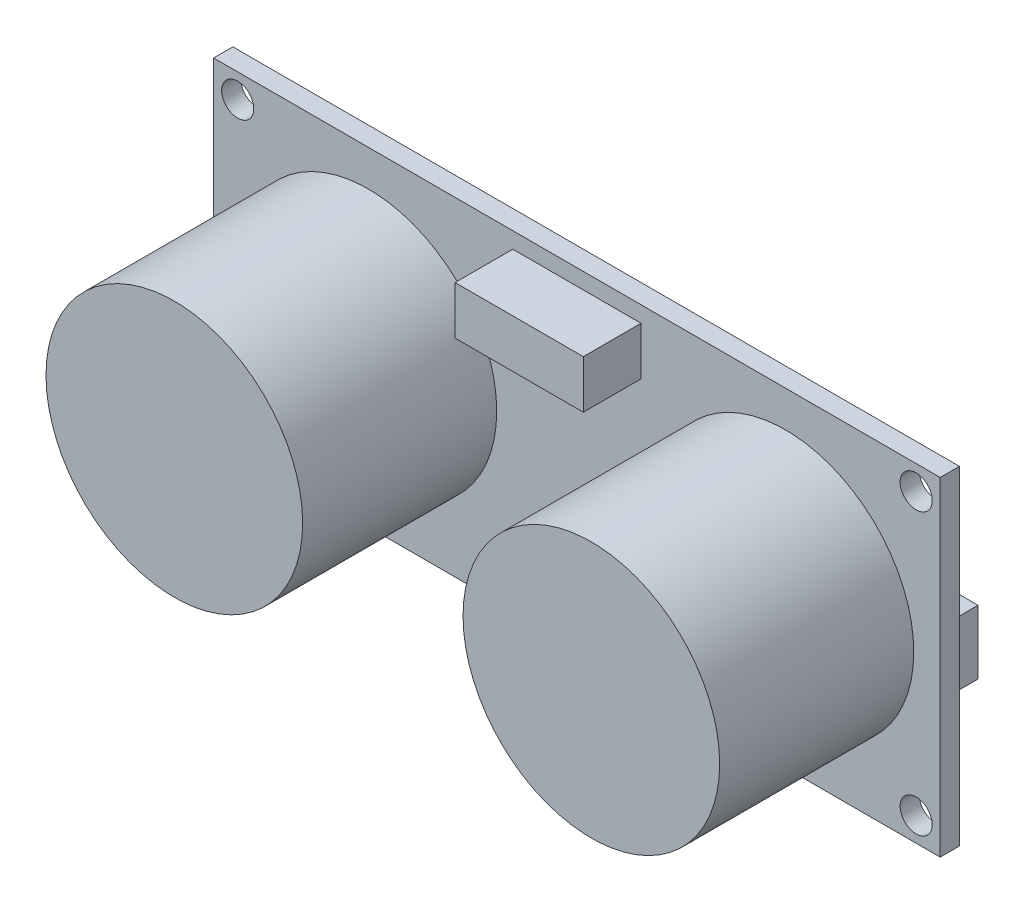
ISO-10303-21;
HEADER;
FILE_DESCRIPTION(('STEP AP214'),'2;1');
FILE_NAME('part.step','',(''),(''),'','','');
FILE_SCHEMA(('AUTOMOTIVE_DESIGN { 1 0 10303 214 1 1 1 1 }'));
ENDSEC;
DATA;
#1=APPLICATION_CONTEXT('core data for automotive mechanical design processes');
#2=APPLICATION_PROTOCOL_DEFINITION('international standard','automotive_design',2000,#1);
#3=PRODUCT_CONTEXT('',#1,'mechanical');
#4=PRODUCT('Part','Part','',(#3));
#5=PRODUCT_RELATED_PRODUCT_CATEGORY('part','',(#4));
#6=PRODUCT_DEFINITION_FORMATION('','',#4);
#7=PRODUCT_DEFINITION_CONTEXT('part definition',#1,'design');
#8=PRODUCT_DEFINITION('design','',#6,#7);
#9=PRODUCT_DEFINITION_SHAPE('','',#8);
#10=(LENGTH_UNIT() NAMED_UNIT(*) SI_UNIT(.MILLI.,.METRE.));
#11=(NAMED_UNIT(*) PLANE_ANGLE_UNIT() SI_UNIT($,.RADIAN.));
#12=(NAMED_UNIT(*) SI_UNIT($,.STERADIAN.) SOLID_ANGLE_UNIT());
#13=UNCERTAINTY_MEASURE_WITH_UNIT(LENGTH_MEASURE(1.E-05),#10,'distance_accuracy_value','');
#14=(GEOMETRIC_REPRESENTATION_CONTEXT(3) GLOBAL_UNCERTAINTY_ASSIGNED_CONTEXT((#13)) GLOBAL_UNIT_ASSIGNED_CONTEXT((#10,
#11,#12)) REPRESENTATION_CONTEXT('',''));
#15=CARTESIAN_POINT('',(0.,0.,0.));
#16=DIRECTION('',(0.,0.,1.));
#17=DIRECTION('',(1.,0.,0.));
#18=AXIS2_PLACEMENT_3D('',#15,#16,#17);
#19=CARTESIAN_POINT('',(0.,0.,1.2));
#20=DIRECTION('',(0.,0.,1.));
#21=DIRECTION('',(1.,0.,0.));
#22=AXIS2_PLACEMENT_3D('',#19,#20,#21);
#23=PLANE('',#22);
#24=CARTESIAN_POINT('',(4.03189160296243,-8.25,1.2));
#25=DIRECTION('',(0.,0.,1.));
#26=DIRECTION('',(1.,0.,0.));
#27=AXIS2_PLACEMENT_3D('',#24,#25,#26);
#28=CIRCLE('',#27,1.27);
#29=CARTESIAN_POINT('',(5.30189160296243,-8.25,1.2));
#30=VERTEX_POINT('',#29);
#31=EDGE_CURVE('E196',#30,#30,#28,.F.);
#32=ORIENTED_EDGE('',*,*,#31,.T.);
#33=EDGE_LOOP('',(#32));
#34=FACE_BOUND('',#33,.T.);
#35=CARTESIAN_POINT('',(-13.,0.,1.2));
#36=DIRECTION('',(0.,0.,1.));
#37=DIRECTION('',(1.,0.,0.));
#38=AXIS2_PLACEMENT_3D('',#35,#36,#37);
#39=CIRCLE('',#38,8.);
#40=CARTESIAN_POINT('',(-4.99999999999999,0.,1.2));
#41=VERTEX_POINT('',#40);
#42=EDGE_CURVE('E316',#41,#41,#39,.T.);
#43=ORIENTED_EDGE('',*,*,#42,.F.);
#44=EDGE_LOOP('',(#43));
#45=FACE_BOUND('',#44,.T.);
#46=CARTESIAN_POINT('',(13.,0.,1.2));
#47=DIRECTION('',(0.,0.,1.));
#48=DIRECTION('',(1.,0.,0.));
#49=AXIS2_PLACEMENT_3D('',#46,#47,#48);
#50=CIRCLE('',#49,8.);
#51=CARTESIAN_POINT('',(21.,0.,1.2));
#52=VERTEX_POINT('',#51);
#53=EDGE_CURVE('E311',#52,#52,#50,.T.);
#54=ORIENTED_EDGE('',*,*,#53,.F.);
#55=EDGE_LOOP('',(#54));
#56=FACE_BOUND('',#55,.T.);
#57=CARTESIAN_POINT('',(-21.15,-8.75000000000006,1.2));
#58=DIRECTION('',(0.,0.,1.));
#59=DIRECTION('',(-1.,0.,0.));
#60=AXIS2_PLACEMENT_3D('',#57,#58,#59);
#61=CIRCLE('',#60,1.);
#62=CARTESIAN_POINT('',(-22.15,-8.75000000000006,1.2));
#63=VERTEX_POINT('',#62);
#64=EDGE_CURVE('E296',#63,#63,#61,.T.);
#65=ORIENTED_EDGE('',*,*,#64,.F.);
#66=EDGE_LOOP('',(#65));
#67=FACE_BOUND('',#66,.T.);
#68=CARTESIAN_POINT('',(-21.15,8.75,1.2));
#69=DIRECTION('',(0.,0.,1.));
#70=DIRECTION('',(1.,0.,0.));
#71=AXIS2_PLACEMENT_3D('',#68,#69,#70);
#72=CIRCLE('',#71,1.);
#73=CARTESIAN_POINT('',(-20.15,8.75,1.2));
#74=VERTEX_POINT('',#73);
#75=EDGE_CURVE('E308',#74,#74,#72,.T.);
#76=ORIENTED_EDGE('',*,*,#75,.F.);
#77=EDGE_LOOP('',(#76));
#78=FACE_BOUND('',#77,.T.);
#79=DIRECTION('',(0.,1.,0.));
#80=VECTOR('',#79,1.);
#81=CARTESIAN_POINT('',(22.65,10.25,1.2));
#82=LINE('',#81,#80);
#83=CARTESIAN_POINT('',(22.65,-10.25,1.2));
#84=VERTEX_POINT('',#83);
#85=CARTESIAN_POINT('',(22.65,10.25,1.2));
#86=VERTEX_POINT('',#85);
#87=EDGE_CURVE('E320',#84,#86,#82,.T.);
#88=ORIENTED_EDGE('',*,*,#87,.T.);
#89=DIRECTION('',(-1.,0.,0.));
#90=VECTOR('',#89,1.);
#91=CARTESIAN_POINT('',(-22.65,10.25,1.2));
#92=LINE('',#91,#90);
#93=CARTESIAN_POINT('',(-22.65,10.25,1.2));
#94=VERTEX_POINT('',#93);
#95=EDGE_CURVE('E323',#86,#94,#92,.T.);
#96=ORIENTED_EDGE('',*,*,#95,.T.);
#97=DIRECTION('',(0.,-1.,0.));
#98=VECTOR('',#97,1.);
#99=CARTESIAN_POINT('',(-22.65,10.25,1.2));
#100=LINE('',#99,#98);
#101=CARTESIAN_POINT('',(-22.65,-10.25,1.2));
#102=VERTEX_POINT('',#101);
#103=EDGE_CURVE('E326',#94,#102,#100,.T.);
#104=ORIENTED_EDGE('',*,*,#103,.T.);
#105=DIRECTION('',(1.,0.,0.));
#106=VECTOR('',#105,1.);
#107=CARTESIAN_POINT('',(-22.65,-10.25,1.2));
#108=LINE('',#107,#106);
#109=EDGE_CURVE('E328',#102,#84,#108,.T.);
#110=ORIENTED_EDGE('',*,*,#109,.T.);
#111=EDGE_LOOP('',(#88,#96,#104,#110));
#112=FACE_BOUND('',#111,.T.);
#113=CARTESIAN_POINT('',(21.15,8.75,1.2));
#114=DIRECTION('',(0.,0.,1.));
#115=DIRECTION('',(-1.,0.,0.));
#116=AXIS2_PLACEMENT_3D('',#113,#114,#115);
#117=CIRCLE('',#116,1.);
#118=CARTESIAN_POINT('',(20.15,8.75,1.2));
#119=VERTEX_POINT('',#118);
#120=EDGE_CURVE('E302',#119,#119,#117,.T.);
#121=ORIENTED_EDGE('',*,*,#120,.F.);
#122=EDGE_LOOP('',(#121));
#123=FACE_BOUND('',#122,.T.);
#124=CARTESIAN_POINT('',(21.15,-8.74999999999996,1.2));
#125=DIRECTION('',(0.,0.,1.));
#126=DIRECTION('',(1.,0.,0.));
#127=AXIS2_PLACEMENT_3D('',#124,#125,#126);
#128=CIRCLE('',#127,1.);
#129=CARTESIAN_POINT('',(22.15,-8.74999999999996,1.2));
#130=VERTEX_POINT('',#129);
#131=EDGE_CURVE('E290',#130,#130,#128,.T.);
#132=ORIENTED_EDGE('',*,*,#131,.F.);
#133=EDGE_LOOP('',(#132));
#134=FACE_BOUND('',#133,.T.);
#135=DIRECTION('',(0.,1.,0.));
#136=VECTOR('',#135,1.);
#137=CARTESIAN_POINT('',(-4.,0.,1.2));
#138=LINE('',#137,#136);
#139=CARTESIAN_POINT('',(-4.,6.25,1.2));
#140=VERTEX_POINT('',#139);
#141=CARTESIAN_POINT('',(-4.,9.25,1.2));
#142=VERTEX_POINT('',#141);
#143=EDGE_CURVE('E277',#140,#142,#138,.T.);
#144=ORIENTED_EDGE('',*,*,#143,.T.);
#145=DIRECTION('',(1.,0.,0.));
#146=VECTOR('',#145,1.);
#147=CARTESIAN_POINT('',(0.,9.25,1.2));
#148=LINE('',#147,#146);
#149=CARTESIAN_POINT('',(4.,9.25,1.2));
#150=VERTEX_POINT('',#149);
#151=EDGE_CURVE('E280',#142,#150,#148,.T.);
#152=ORIENTED_EDGE('',*,*,#151,.T.);
#153=DIRECTION('',(0.,-1.,0.));
#154=VECTOR('',#153,1.);
#155=CARTESIAN_POINT('',(4.,0.,1.2));
#156=LINE('',#155,#154);
#157=CARTESIAN_POINT('',(4.,6.25,1.2));
#158=VERTEX_POINT('',#157);
#159=EDGE_CURVE('E271',#150,#158,#156,.T.);
#160=ORIENTED_EDGE('',*,*,#159,.T.);
#161=DIRECTION('',(-1.,0.,0.));
#162=VECTOR('',#161,1.);
#163=CARTESIAN_POINT('',(0.,6.25,1.2));
#164=LINE('',#163,#162);
#165=EDGE_CURVE('E274',#158,#140,#164,.T.);
#166=ORIENTED_EDGE('',*,*,#165,.T.);
#167=EDGE_LOOP('',(#144,#152,#160,#166));
#168=FACE_BOUND('',#167,.T.);
#169=ADVANCED_FACE('F35',(#34,#45,#56,#67,#78,#112,#123,#134,#168),#23,.T.);
#170=CARTESIAN_POINT('',(0.,0.,0.));
#171=DIRECTION('',(0.,0.,1.));
#172=DIRECTION('',(1.,0.,0.));
#173=AXIS2_PLACEMENT_3D('',#170,#171,#172);
#174=PLANE('',#173);
#175=CARTESIAN_POINT('',(4.03189160296243,-8.25,0.));
#176=DIRECTION('',(0.,0.,-1.));
#177=DIRECTION('',(-1.,0.,0.));
#178=AXIS2_PLACEMENT_3D('',#175,#176,#177);
#179=CIRCLE('',#178,1.27);
#180=CARTESIAN_POINT('',(2.76189160296243,-8.25,0.));
#181=VERTEX_POINT('',#180);
#182=EDGE_CURVE('E193',#181,#181,#179,.T.);
#183=ORIENTED_EDGE('',*,*,#182,.F.);
#184=EDGE_LOOP('',(#183));
#185=FACE_BOUND('',#184,.T.);
#186=DIRECTION('',(-1.,0.,0.));
#187=VECTOR('',#186,1.);
#188=CARTESIAN_POINT('',(0.,5.91088257171505,0.));
#189=LINE('',#188,#187);
#190=CARTESIAN_POINT('',(-16.2936688119185,5.91088257171505,0.));
#191=VERTEX_POINT('',#190);
#192=CARTESIAN_POINT('',(-21.6068216853702,5.91088257171505,0.));
#193=VERTEX_POINT('',#192);
#194=EDGE_CURVE('E43',#191,#193,#189,.T.);
#195=ORIENTED_EDGE('',*,*,#194,.T.);
#196=DIRECTION('',(0.,-1.,0.));
#197=VECTOR('',#196,1.);
#198=CARTESIAN_POINT('',(-21.6068216853702,0.,0.));
#199=LINE('',#198,#197);
#200=CARTESIAN_POINT('',(-21.6068216853702,-5.29101473647895,0.));
#201=VERTEX_POINT('',#200);
#202=EDGE_CURVE('E11',#193,#201,#199,.T.);
#203=ORIENTED_EDGE('',*,*,#202,.T.);
#204=DIRECTION('',(1.,0.,0.));
#205=VECTOR('',#204,1.);
#206=CARTESIAN_POINT('',(0.,-5.29101473647895,0.));
#207=LINE('',#206,#205);
#208=CARTESIAN_POINT('',(-16.2936688119185,-5.29101473647895,0.));
#209=VERTEX_POINT('',#208);
#210=EDGE_CURVE('E175',#201,#209,#207,.T.);
#211=ORIENTED_EDGE('',*,*,#210,.T.);
#212=DIRECTION('',(0.,1.,0.));
#213=VECTOR('',#212,1.);
#214=CARTESIAN_POINT('',(-16.2936688119185,0.,0.));
#215=LINE('',#214,#213);
#216=EDGE_CURVE('E374',#209,#191,#215,.T.);
#217=ORIENTED_EDGE('',*,*,#216,.T.);
#218=EDGE_LOOP('',(#195,#203,#211,#217));
#219=FACE_BOUND('',#218,.T.);
#220=DIRECTION('',(0.,-1.,0.));
#221=VECTOR('',#220,1.);
#222=CARTESIAN_POINT('',(-4.38335112059764,0.,0.));
#223=LINE('',#222,#221);
#224=CARTESIAN_POINT('',(-4.38335112059764,4.13983161389782,0.));
#225=VERTEX_POINT('',#224);
#226=CARTESIAN_POINT('',(-4.38335112059764,-2.45733320397138,0.));
#227=VERTEX_POINT('',#226);
#228=EDGE_CURVE('E367',#225,#227,#223,.T.);
#229=ORIENTED_EDGE('',*,*,#228,.T.);
#230=DIRECTION('',(1.,0.,0.));
#231=VECTOR('',#230,1.);
#232=CARTESIAN_POINT('',(0.,-2.45733320397138,0.));
#233=LINE('',#232,#231);
#234=CARTESIAN_POINT('',(5.18032405161542,-2.45733320397138,0.));
#235=VERTEX_POINT('',#234);
#236=EDGE_CURVE('E370',#227,#235,#233,.T.);
#237=ORIENTED_EDGE('',*,*,#236,.T.);
#238=DIRECTION('',(0.,1.,0.));
#239=VECTOR('',#238,1.);
#240=CARTESIAN_POINT('',(5.18032405161542,0.,0.));
#241=LINE('',#240,#239);
#242=CARTESIAN_POINT('',(5.18032405161542,4.13983161389782,0.));
#243=VERTEX_POINT('',#242);
#244=EDGE_CURVE('E361',#235,#243,#241,.T.);
#245=ORIENTED_EDGE('',*,*,#244,.T.);
#246=DIRECTION('',(-1.,0.,0.));
#247=VECTOR('',#246,1.);
#248=CARTESIAN_POINT('',(0.,4.13983161389782,0.));
#249=LINE('',#248,#247);
#250=EDGE_CURVE('E364',#243,#225,#249,.T.);
#251=ORIENTED_EDGE('',*,*,#250,.T.);
#252=EDGE_LOOP('',(#229,#237,#245,#251));
#253=FACE_BOUND('',#252,.T.);
#254=DIRECTION('',(0.,-1.,0.));
#255=VECTOR('',#254,1.);
#256=CARTESIAN_POINT('',(14.2569602104287,0.,0.));
#257=LINE('',#256,#255);
#258=CARTESIAN_POINT('',(14.2569602104287,1.5275314511174,0.));
#259=VERTEX_POINT('',#258);
#260=CARTESIAN_POINT('',(14.2569602104287,-2.45733320397138,0.));
#261=VERTEX_POINT('',#260);
#262=EDGE_CURVE('E355',#259,#261,#257,.T.);
#263=ORIENTED_EDGE('',*,*,#262,.T.);
#264=DIRECTION('',(1.,0.,0.));
#265=VECTOR('',#264,1.);
#266=CARTESIAN_POINT('',(0.,-2.45733320397138,0.));
#267=LINE('',#266,#265);
#268=CARTESIAN_POINT('',(22.0053081508791,-2.45733320397138,0.));
#269=VERTEX_POINT('',#268);
#270=EDGE_CURVE('E358',#261,#269,#267,.T.);
#271=ORIENTED_EDGE('',*,*,#270,.T.);
#272=DIRECTION('',(0.,1.,0.));
#273=VECTOR('',#272,1.);
#274=CARTESIAN_POINT('',(22.0053081508791,0.,0.));
#275=LINE('',#274,#273);
#276=CARTESIAN_POINT('',(22.0053081508791,1.5275314511174,0.));
#277=VERTEX_POINT('',#276);
#278=EDGE_CURVE('E349',#269,#277,#275,.T.);
#279=ORIENTED_EDGE('',*,*,#278,.T.);
#280=DIRECTION('',(-1.,0.,0.));
#281=VECTOR('',#280,1.);
#282=CARTESIAN_POINT('',(0.,1.5275314511174,0.));
#283=LINE('',#282,#281);
#284=EDGE_CURVE('E352',#277,#259,#283,.T.);
#285=ORIENTED_EDGE('',*,*,#284,.T.);
#286=EDGE_LOOP('',(#263,#271,#279,#285));
#287=FACE_BOUND('',#286,.T.);
#288=CARTESIAN_POINT('',(21.15,-8.74999999999996,0.));
#289=DIRECTION('',(0.,0.,1.));
#290=DIRECTION('',(1.,0.,0.));
#291=AXIS2_PLACEMENT_3D('',#288,#289,#290);
#292=CIRCLE('',#291,1.);
#293=CARTESIAN_POINT('',(22.15,-8.74999999999996,0.));
#294=VERTEX_POINT('',#293);
#295=EDGE_CURVE('E289',#294,#294,#292,.T.);
#296=ORIENTED_EDGE('',*,*,#295,.T.);
#297=EDGE_LOOP('',(#296));
#298=FACE_BOUND('',#297,.T.);
#299=CARTESIAN_POINT('',(-21.15,-8.75000000000006,0.));
#300=DIRECTION('',(0.,0.,1.));
#301=DIRECTION('',(-1.,0.,0.));
#302=AXIS2_PLACEMENT_3D('',#299,#300,#301);
#303=CIRCLE('',#302,1.);
#304=CARTESIAN_POINT('',(-22.15,-8.75000000000006,0.));
#305=VERTEX_POINT('',#304);
#306=EDGE_CURVE('E293',#305,#305,#303,.T.);
#307=ORIENTED_EDGE('',*,*,#306,.T.);
#308=EDGE_LOOP('',(#307));
#309=FACE_BOUND('',#308,.T.);
#310=CARTESIAN_POINT('',(21.15,8.75,0.));
#311=DIRECTION('',(0.,0.,1.));
#312=DIRECTION('',(-1.,0.,0.));
#313=AXIS2_PLACEMENT_3D('',#310,#311,#312);
#314=CIRCLE('',#313,1.);
#315=CARTESIAN_POINT('',(20.15,8.75,0.));
#316=VERTEX_POINT('',#315);
#317=EDGE_CURVE('E299',#316,#316,#314,.T.);
#318=ORIENTED_EDGE('',*,*,#317,.T.);
#319=EDGE_LOOP('',(#318));
#320=FACE_BOUND('',#319,.T.);
#321=CARTESIAN_POINT('',(-21.15,8.75,0.));
#322=DIRECTION('',(0.,0.,1.));
#323=DIRECTION('',(1.,0.,0.));
#324=AXIS2_PLACEMENT_3D('',#321,#322,#323);
#325=CIRCLE('',#324,1.);
#326=CARTESIAN_POINT('',(-20.15,8.75,0.));
#327=VERTEX_POINT('',#326);
#328=EDGE_CURVE('E305',#327,#327,#325,.T.);
#329=ORIENTED_EDGE('',*,*,#328,.T.);
#330=EDGE_LOOP('',(#329));
#331=FACE_BOUND('',#330,.T.);
#332=DIRECTION('',(0.,1.,0.));
#333=VECTOR('',#332,1.);
#334=CARTESIAN_POINT('',(22.65,10.25,0.));
#335=LINE('',#334,#333);
#336=CARTESIAN_POINT('',(22.65,-10.25,0.));
#337=VERTEX_POINT('',#336);
#338=CARTESIAN_POINT('',(22.65,10.25,0.));
#339=VERTEX_POINT('',#338);
#340=EDGE_CURVE('E319',#337,#339,#335,.T.);
#341=ORIENTED_EDGE('',*,*,#340,.F.);
#342=DIRECTION('',(1.,0.,0.));
#343=VECTOR('',#342,1.);
#344=CARTESIAN_POINT('',(-22.65,-10.25,0.));
#345=LINE('',#344,#343);
#346=CARTESIAN_POINT('',(-22.65,-10.25,0.));
#347=VERTEX_POINT('',#346);
#348=EDGE_CURVE('E324',#347,#337,#345,.T.);
#349=ORIENTED_EDGE('',*,*,#348,.F.);
#350=DIRECTION('',(0.,-1.,0.));
#351=VECTOR('',#350,1.);
#352=CARTESIAN_POINT('',(-22.65,10.25,0.));
#353=LINE('',#352,#351);
#354=CARTESIAN_POINT('',(-22.65,10.25,0.));
#355=VERTEX_POINT('',#354);
#356=EDGE_CURVE('E335',#355,#347,#353,.T.);
#357=ORIENTED_EDGE('',*,*,#356,.F.);
#358=DIRECTION('',(-1.,0.,0.));
#359=VECTOR('',#358,1.);
#360=CARTESIAN_POINT('',(-22.65,10.25,0.));
#361=LINE('',#360,#359);
#362=EDGE_CURVE('E333',#339,#355,#361,.T.);
#363=ORIENTED_EDGE('',*,*,#362,.F.);
#364=EDGE_LOOP('',(#341,#349,#357,#363));
#365=FACE_BOUND('',#364,.T.);
#366=ADVANCED_FACE('F378',(#185,#219,#253,#287,#298,#309,#320,#331,#365),#174,.F.);
#367=CARTESIAN_POINT('',(22.65,10.25,1.2));
#368=DIRECTION('',(-1.,0.,0.));
#369=DIRECTION('',(0.,0.,1.));
#370=AXIS2_PLACEMENT_3D('',#367,#368,#369);
#371=PLANE('',#370);
#372=ORIENTED_EDGE('',*,*,#340,.T.);
#373=DIRECTION('',(0.,0.,-1.));
#374=VECTOR('',#373,1.);
#375=CARTESIAN_POINT('',(22.65,10.25,1.2));
#376=LINE('',#375,#374);
#377=EDGE_CURVE('E346',#86,#339,#376,.T.);
#378=ORIENTED_EDGE('',*,*,#377,.F.);
#379=ORIENTED_EDGE('',*,*,#87,.F.);
#380=DIRECTION('',(0.,0.,-1.));
#381=VECTOR('',#380,1.);
#382=CARTESIAN_POINT('',(22.65,-10.25,1.2));
#383=LINE('',#382,#381);
#384=EDGE_CURVE('E330',#84,#337,#383,.T.);
#385=ORIENTED_EDGE('',*,*,#384,.T.);
#386=EDGE_LOOP('',(#372,#378,#379,#385));
#387=FACE_BOUND('',#386,.T.);
#388=ADVANCED_FACE('F37',(#387),#371,.F.);
#389=CARTESIAN_POINT('',(-22.65,10.25,1.2));
#390=DIRECTION('',(0.,-1.,0.));
#391=DIRECTION('',(0.,0.,-1.));
#392=AXIS2_PLACEMENT_3D('',#389,#390,#391);
#393=PLANE('',#392);
#394=ORIENTED_EDGE('',*,*,#362,.T.);
#395=DIRECTION('',(0.,0.,-1.));
#396=VECTOR('',#395,1.);
#397=CARTESIAN_POINT('',(-22.65,10.25,1.2));
#398=LINE('',#397,#396);
#399=EDGE_CURVE('E343',#94,#355,#398,.T.);
#400=ORIENTED_EDGE('',*,*,#399,.F.);
#401=ORIENTED_EDGE('',*,*,#95,.F.);
#402=ORIENTED_EDGE('',*,*,#377,.T.);
#403=EDGE_LOOP('',(#394,#400,#401,#402));
#404=FACE_BOUND('',#403,.T.);
#405=ADVANCED_FACE('F413',(#404),#393,.F.);
#406=CARTESIAN_POINT('',(-22.65,10.25,1.2));
#407=DIRECTION('',(1.,0.,0.));
#408=DIRECTION('',(0.,0.,-1.));
#409=AXIS2_PLACEMENT_3D('',#406,#407,#408);
#410=PLANE('',#409);
#411=ORIENTED_EDGE('',*,*,#356,.T.);
#412=DIRECTION('',(0.,0.,-1.));
#413=VECTOR('',#412,1.);
#414=CARTESIAN_POINT('',(-22.65,-10.25,1.2));
#415=LINE('',#414,#413);
#416=EDGE_CURVE('E340',#102,#347,#415,.T.);
#417=ORIENTED_EDGE('',*,*,#416,.F.);
#418=ORIENTED_EDGE('',*,*,#103,.F.);
#419=ORIENTED_EDGE('',*,*,#399,.T.);
#420=EDGE_LOOP('',(#411,#417,#418,#419));
#421=FACE_BOUND('',#420,.T.);
#422=ADVANCED_FACE('F410',(#421),#410,.F.);
#423=CARTESIAN_POINT('',(-22.65,-10.25,1.2));
#424=DIRECTION('',(0.,1.,0.));
#425=DIRECTION('',(0.,0.,1.));
#426=AXIS2_PLACEMENT_3D('',#423,#424,#425);
#427=PLANE('',#426);
#428=ORIENTED_EDGE('',*,*,#348,.T.);
#429=ORIENTED_EDGE('',*,*,#384,.F.);
#430=ORIENTED_EDGE('',*,*,#109,.F.);
#431=ORIENTED_EDGE('',*,*,#416,.T.);
#432=EDGE_LOOP('',(#428,#429,#430,#431));
#433=FACE_BOUND('',#432,.T.);
#434=ADVANCED_FACE('F407',(#433),#427,.F.);
#435=CARTESIAN_POINT('',(-21.15,8.75,1.2));
#436=DIRECTION('',(0.,0.,-1.));
#437=DIRECTION('',(-1.,0.,0.));
#438=AXIS2_PLACEMENT_3D('',#435,#436,#437);
#439=CYLINDRICAL_SURFACE('',#438,1.);
#440=ORIENTED_EDGE('',*,*,#75,.T.);
#441=EDGE_LOOP('',(#440));
#442=FACE_BOUND('',#441,.T.);
#443=ORIENTED_EDGE('',*,*,#328,.F.);
#444=EDGE_LOOP('',(#443));
#445=FACE_BOUND('',#444,.T.);
#446=ADVANCED_FACE('F404',(#442,#445),#439,.F.);
#447=CARTESIAN_POINT('',(21.15,8.75,1.2));
#448=DIRECTION('',(0.,0.,-1.));
#449=DIRECTION('',(-1.,0.,0.));
#450=AXIS2_PLACEMENT_3D('',#447,#448,#449);
#451=CYLINDRICAL_SURFACE('',#450,1.);
#452=ORIENTED_EDGE('',*,*,#120,.T.);
#453=EDGE_LOOP('',(#452));
#454=FACE_BOUND('',#453,.T.);
#455=ORIENTED_EDGE('',*,*,#317,.F.);
#456=EDGE_LOOP('',(#455));
#457=FACE_BOUND('',#456,.T.);
#458=ADVANCED_FACE('F493',(#454,#457),#451,.F.);
#459=CARTESIAN_POINT('',(-21.15,-8.75000000000006,1.2));
#460=DIRECTION('',(0.,0.,-1.));
#461=DIRECTION('',(-1.,0.,0.));
#462=AXIS2_PLACEMENT_3D('',#459,#460,#461);
#463=CYLINDRICAL_SURFACE('',#462,1.);
#464=ORIENTED_EDGE('',*,*,#64,.T.);
#465=EDGE_LOOP('',(#464));
#466=FACE_BOUND('',#465,.T.);
#467=ORIENTED_EDGE('',*,*,#306,.F.);
#468=EDGE_LOOP('',(#467));
#469=FACE_BOUND('',#468,.T.);
#470=ADVANCED_FACE('F490',(#466,#469),#463,.F.);
#471=CARTESIAN_POINT('',(21.15,-8.74999999999996,1.2));
#472=DIRECTION('',(0.,0.,-1.));
#473=DIRECTION('',(-1.,0.,0.));
#474=AXIS2_PLACEMENT_3D('',#471,#472,#473);
#475=CYLINDRICAL_SURFACE('',#474,1.);
#476=ORIENTED_EDGE('',*,*,#131,.T.);
#477=EDGE_LOOP('',(#476));
#478=FACE_BOUND('',#477,.T.);
#479=ORIENTED_EDGE('',*,*,#295,.F.);
#480=EDGE_LOOP('',(#479));
#481=FACE_BOUND('',#480,.T.);
#482=ADVANCED_FACE('F486',(#478,#481),#475,.F.);
#483=CARTESIAN_POINT('',(13.,0.,13.3));
#484=DIRECTION('',(0.,0.,-1.));
#485=DIRECTION('',(-1.,0.,0.));
#486=AXIS2_PLACEMENT_3D('',#483,#484,#485);
#487=CYLINDRICAL_SURFACE('',#486,8.);
#488=ORIENTED_EDGE('',*,*,#53,.T.);
#489=EDGE_LOOP('',(#488));
#490=FACE_BOUND('',#489,.T.);
#491=CARTESIAN_POINT('',(13.,0.,13.3));
#492=DIRECTION('',(0.,0.,1.));
#493=DIRECTION('',(1.,0.,0.));
#494=AXIS2_PLACEMENT_3D('',#491,#492,#493);
#495=CIRCLE('',#494,8.);
#496=CARTESIAN_POINT('',(21.,0.,13.3));
#497=VERTEX_POINT('',#496);
#498=EDGE_CURVE('E286',#497,#497,#495,.T.);
#499=ORIENTED_EDGE('',*,*,#498,.F.);
#500=EDGE_LOOP('',(#499));
#501=FACE_BOUND('',#500,.T.);
#502=ADVANCED_FACE('F482',(#490,#501),#487,.T.);
#503=CARTESIAN_POINT('',(13.,0.,13.3));
#504=DIRECTION('',(0.,0.,1.));
#505=DIRECTION('',(1.,0.,0.));
#506=AXIS2_PLACEMENT_3D('',#503,#504,#505);
#507=PLANE('',#506);
#508=ORIENTED_EDGE('',*,*,#498,.T.);
#509=EDGE_LOOP('',(#508));
#510=FACE_BOUND('',#509,.T.);
#511=ADVANCED_FACE('F478',(#510),#507,.T.);
#512=CARTESIAN_POINT('',(-13.,0.,13.3));
#513=DIRECTION('',(0.,0.,-1.));
#514=DIRECTION('',(-1.,0.,0.));
#515=AXIS2_PLACEMENT_3D('',#512,#513,#514);
#516=CYLINDRICAL_SURFACE('',#515,8.);
#517=ORIENTED_EDGE('',*,*,#42,.T.);
#518=EDGE_LOOP('',(#517));
#519=FACE_BOUND('',#518,.T.);
#520=CARTESIAN_POINT('',(-13.,0.,13.3));
#521=DIRECTION('',(0.,0.,1.));
#522=DIRECTION('',(1.,0.,0.));
#523=AXIS2_PLACEMENT_3D('',#520,#521,#522);
#524=CIRCLE('',#523,8.);
#525=CARTESIAN_POINT('',(-4.99999999999999,0.,13.3));
#526=VERTEX_POINT('',#525);
#527=EDGE_CURVE('E283',#526,#526,#524,.T.);
#528=ORIENTED_EDGE('',*,*,#527,.F.);
#529=EDGE_LOOP('',(#528));
#530=FACE_BOUND('',#529,.T.);
#531=ADVANCED_FACE('F474',(#519,#530),#516,.T.);
#532=CARTESIAN_POINT('',(-13.,0.,13.3));
#533=DIRECTION('',(0.,0.,1.));
#534=DIRECTION('',(1.,0.,0.));
#535=AXIS2_PLACEMENT_3D('',#532,#533,#534);
#536=PLANE('',#535);
#537=ORIENTED_EDGE('',*,*,#527,.T.);
#538=EDGE_LOOP('',(#537));
#539=FACE_BOUND('',#538,.T.);
#540=ADVANCED_FACE('F471',(#539),#536,.T.);
#541=CARTESIAN_POINT('',(0.,9.25,4.8));
#542=DIRECTION('',(0.,-1.,0.));
#543=DIRECTION('',(1.,0.,0.));
#544=AXIS2_PLACEMENT_3D('',#541,#542,#543);
#545=PLANE('',#544);
#546=ORIENTED_EDGE('',*,*,#151,.F.);
#547=DIRECTION('',(0.,0.,-1.));
#548=VECTOR('',#547,1.);
#549=CARTESIAN_POINT('',(-4.,9.25,4.8));
#550=LINE('',#549,#548);
#551=CARTESIAN_POINT('',(-4.,9.25,4.8));
#552=VERTEX_POINT('',#551);
#553=EDGE_CURVE('E268',#552,#142,#550,.T.);
#554=ORIENTED_EDGE('',*,*,#553,.F.);
#555=DIRECTION('',(-1.,0.,0.));
#556=VECTOR('',#555,1.);
#557=CARTESIAN_POINT('',(0.,9.25,4.8));
#558=LINE('',#557,#556);
#559=CARTESIAN_POINT('',(4.,9.25,4.8));
#560=VERTEX_POINT('',#559);
#561=EDGE_CURVE('E244',#560,#552,#558,.T.);
#562=ORIENTED_EDGE('',*,*,#561,.F.);
#563=DIRECTION('',(0.,0.,-1.));
#564=VECTOR('',#563,1.);
#565=CARTESIAN_POINT('',(4.,9.25,4.8));
#566=LINE('',#565,#564);
#567=EDGE_CURVE('E260',#560,#150,#566,.T.);
#568=ORIENTED_EDGE('',*,*,#567,.T.);
#569=EDGE_LOOP('',(#546,#554,#562,#568));
#570=FACE_BOUND('',#569,.T.);
#571=ADVANCED_FACE('F453',(#570),#545,.F.);
#572=CARTESIAN_POINT('',(-4.,0.,4.8));
#573=DIRECTION('',(1.,0.,0.));
#574=DIRECTION('',(0.,0.,-1.));
#575=AXIS2_PLACEMENT_3D('',#572,#573,#574);
#576=PLANE('',#575);
#577=ORIENTED_EDGE('',*,*,#143,.F.);
#578=DIRECTION('',(0.,0.,-1.));
#579=VECTOR('',#578,1.);
#580=CARTESIAN_POINT('',(-4.,6.25,4.8));
#581=LINE('',#580,#579);
#582=CARTESIAN_POINT('',(-4.,6.25,4.8));
#583=VERTEX_POINT('',#582);
#584=EDGE_CURVE('E265',#583,#140,#581,.T.);
#585=ORIENTED_EDGE('',*,*,#584,.F.);
#586=DIRECTION('',(0.,-1.,0.));
#587=VECTOR('',#586,1.);
#588=CARTESIAN_POINT('',(-4.,0.,4.8));
#589=LINE('',#588,#587);
#590=EDGE_CURVE('E254',#552,#583,#589,.T.);
#591=ORIENTED_EDGE('',*,*,#590,.F.);
#592=ORIENTED_EDGE('',*,*,#553,.T.);
#593=EDGE_LOOP('',(#577,#585,#591,#592));
#594=FACE_BOUND('',#593,.T.);
#595=ADVANCED_FACE('F441',(#594),#576,.F.);
#596=CARTESIAN_POINT('',(0.,6.25,4.8));
#597=DIRECTION('',(0.,1.,0.));
#598=DIRECTION('',(-1.,0.,0.));
#599=AXIS2_PLACEMENT_3D('',#596,#597,#598);
#600=PLANE('',#599);
#601=ORIENTED_EDGE('',*,*,#165,.F.);
#602=DIRECTION('',(0.,0.,-1.));
#603=VECTOR('',#602,1.);
#604=CARTESIAN_POINT('',(4.,6.25,4.8));
#605=LINE('',#604,#603);
#606=CARTESIAN_POINT('',(4.,6.25,4.8));
#607=VERTEX_POINT('',#606);
#608=EDGE_CURVE('E263',#607,#158,#605,.T.);
#609=ORIENTED_EDGE('',*,*,#608,.F.);
#610=DIRECTION('',(1.,0.,0.));
#611=VECTOR('',#610,1.);
#612=CARTESIAN_POINT('',(0.,6.25,4.8));
#613=LINE('',#612,#611);
#614=EDGE_CURVE('E256',#583,#607,#613,.T.);
#615=ORIENTED_EDGE('',*,*,#614,.F.);
#616=ORIENTED_EDGE('',*,*,#584,.T.);
#617=EDGE_LOOP('',(#601,#609,#615,#616));
#618=FACE_BOUND('',#617,.T.);
#619=ADVANCED_FACE('F445',(#618),#600,.F.);
#620=CARTESIAN_POINT('',(4.,0.,4.8));
#621=DIRECTION('',(-1.,0.,0.));
#622=DIRECTION('',(0.,0.,1.));
#623=AXIS2_PLACEMENT_3D('',#620,#621,#622);
#624=PLANE('',#623);
#625=ORIENTED_EDGE('',*,*,#159,.F.);
#626=ORIENTED_EDGE('',*,*,#567,.F.);
#627=DIRECTION('',(0.,1.,0.));
#628=VECTOR('',#627,1.);
#629=CARTESIAN_POINT('',(4.,0.,4.8));
#630=LINE('',#629,#628);
#631=EDGE_CURVE('E258',#607,#560,#630,.T.);
#632=ORIENTED_EDGE('',*,*,#631,.F.);
#633=ORIENTED_EDGE('',*,*,#608,.T.);
#634=EDGE_LOOP('',(#625,#626,#632,#633));
#635=FACE_BOUND('',#634,.T.);
#636=ADVANCED_FACE('F455',(#635),#624,.F.);
#637=CARTESIAN_POINT('',(0.,0.,4.8));
#638=DIRECTION('',(0.,0.,1.));
#639=DIRECTION('',(1.,0.,0.));
#640=AXIS2_PLACEMENT_3D('',#637,#638,#639);
#641=PLANE('',#640);
#642=ORIENTED_EDGE('',*,*,#561,.T.);
#643=ORIENTED_EDGE('',*,*,#590,.T.);
#644=ORIENTED_EDGE('',*,*,#614,.T.);
#645=ORIENTED_EDGE('',*,*,#631,.T.);
#646=EDGE_LOOP('',(#642,#643,#644,#645));
#647=FACE_BOUND('',#646,.T.);
#648=ADVANCED_FACE('F449',(#647),#641,.T.);
#649=CARTESIAN_POINT('',(0.,-2.45733320397138,-1.8));
#650=DIRECTION('',(0.,-1.,0.));
#651=DIRECTION('',(0.,0.,-1.));
#652=AXIS2_PLACEMENT_3D('',#649,#650,#651);
#653=PLANE('',#652);
#654=ORIENTED_EDGE('',*,*,#270,.F.);
#655=DIRECTION('',(0.,0.,1.));
#656=VECTOR('',#655,1.);
#657=CARTESIAN_POINT('',(14.2569602104287,-2.45733320397138,-1.8));
#658=LINE('',#657,#656);
#659=CARTESIAN_POINT('',(14.2569602104287,-2.45733320397138,-1.8));
#660=VERTEX_POINT('',#659);
#661=EDGE_CURVE('E241',#660,#261,#658,.T.);
#662=ORIENTED_EDGE('',*,*,#661,.F.);
#663=DIRECTION('',(1.,0.,0.));
#664=VECTOR('',#663,1.);
#665=CARTESIAN_POINT('',(0.,-2.45733320397138,-1.8));
#666=LINE('',#665,#664);
#667=CARTESIAN_POINT('',(22.0053081508791,-2.45733320397138,-1.8));
#668=VERTEX_POINT('',#667);
#669=EDGE_CURVE('E222',#660,#668,#666,.T.);
#670=ORIENTED_EDGE('',*,*,#669,.T.);
#671=DIRECTION('',(0.,0.,1.));
#672=VECTOR('',#671,1.);
#673=CARTESIAN_POINT('',(22.0053081508791,-2.45733320397138,-1.8));
#674=LINE('',#673,#672);
#675=EDGE_CURVE('E240',#668,#269,#674,.T.);
#676=ORIENTED_EDGE('',*,*,#675,.T.);
#677=EDGE_LOOP('',(#654,#662,#670,#676));
#678=FACE_BOUND('',#677,.T.);
#679=ADVANCED_FACE('F462',(#678),#653,.T.);
#680=CARTESIAN_POINT('',(14.2569602104287,0.,-1.8));
#681=DIRECTION('',(-1.,0.,0.));
#682=DIRECTION('',(0.,0.,1.));
#683=AXIS2_PLACEMENT_3D('',#680,#681,#682);
#684=PLANE('',#683);
#685=ORIENTED_EDGE('',*,*,#262,.F.);
#686=DIRECTION('',(0.,0.,1.));
#687=VECTOR('',#686,1.);
#688=CARTESIAN_POINT('',(14.2569602104287,1.5275314511174,-1.8));
#689=LINE('',#688,#687);
#690=CARTESIAN_POINT('',(14.2569602104287,1.5275314511174,-1.8));
#691=VERTEX_POINT('',#690);
#692=EDGE_CURVE('E245',#691,#259,#689,.T.);
#693=ORIENTED_EDGE('',*,*,#692,.F.);
#694=DIRECTION('',(0.,-1.,0.));
#695=VECTOR('',#694,1.);
#696=CARTESIAN_POINT('',(14.2569602104287,0.,-1.8));
#697=LINE('',#696,#695);
#698=EDGE_CURVE('E237',#691,#660,#697,.T.);
#699=ORIENTED_EDGE('',*,*,#698,.T.);
#700=ORIENTED_EDGE('',*,*,#661,.T.);
#701=EDGE_LOOP('',(#685,#693,#699,#700));
#702=FACE_BOUND('',#701,.T.);
#703=ADVANCED_FACE('F582',(#702),#684,.T.);
#704=CARTESIAN_POINT('',(0.,1.5275314511174,-1.8));
#705=DIRECTION('',(0.,1.,0.));
#706=DIRECTION('',(0.,0.,1.));
#707=AXIS2_PLACEMENT_3D('',#704,#705,#706);
#708=PLANE('',#707);
#709=ORIENTED_EDGE('',*,*,#284,.F.);
#710=DIRECTION('',(0.,0.,1.));
#711=VECTOR('',#710,1.);
#712=CARTESIAN_POINT('',(22.0053081508791,1.5275314511174,-1.8));
#713=LINE('',#712,#711);
#714=CARTESIAN_POINT('',(22.0053081508791,1.5275314511174,-1.8));
#715=VERTEX_POINT('',#714);
#716=EDGE_CURVE('E248',#715,#277,#713,.T.);
#717=ORIENTED_EDGE('',*,*,#716,.F.);
#718=DIRECTION('',(-1.,0.,0.));
#719=VECTOR('',#718,1.);
#720=CARTESIAN_POINT('',(0.,1.5275314511174,-1.8));
#721=LINE('',#720,#719);
#722=EDGE_CURVE('E234',#715,#691,#721,.T.);
#723=ORIENTED_EDGE('',*,*,#722,.T.);
#724=ORIENTED_EDGE('',*,*,#692,.T.);
#725=EDGE_LOOP('',(#709,#717,#723,#724));
#726=FACE_BOUND('',#725,.T.);
#727=ADVANCED_FACE('F590',(#726),#708,.T.);
#728=CARTESIAN_POINT('',(22.0053081508791,0.,-1.8));
#729=DIRECTION('',(1.,0.,0.));
#730=DIRECTION('',(0.,0.,-1.));
#731=AXIS2_PLACEMENT_3D('',#728,#729,#730);
#732=PLANE('',#731);
#733=ORIENTED_EDGE('',*,*,#278,.F.);
#734=ORIENTED_EDGE('',*,*,#675,.F.);
#735=DIRECTION('',(0.,1.,0.));
#736=VECTOR('',#735,1.);
#737=CARTESIAN_POINT('',(22.0053081508791,0.,-1.8));
#738=LINE('',#737,#736);
#739=EDGE_CURVE('E231',#668,#715,#738,.T.);
#740=ORIENTED_EDGE('',*,*,#739,.T.);
#741=ORIENTED_EDGE('',*,*,#716,.T.);
#742=EDGE_LOOP('',(#733,#734,#740,#741));
#743=FACE_BOUND('',#742,.T.);
#744=ADVANCED_FACE('F599',(#743),#732,.T.);
#745=CARTESIAN_POINT('',(0.,0.,-1.8));
#746=DIRECTION('',(0.,0.,1.));
#747=DIRECTION('',(1.,0.,0.));
#748=AXIS2_PLACEMENT_3D('',#745,#746,#747);
#749=PLANE('',#748);
#750=ORIENTED_EDGE('',*,*,#669,.F.);
#751=ORIENTED_EDGE('',*,*,#698,.F.);
#752=ORIENTED_EDGE('',*,*,#722,.F.);
#753=ORIENTED_EDGE('',*,*,#739,.F.);
#754=EDGE_LOOP('',(#750,#751,#752,#753));
#755=FACE_BOUND('',#754,.T.);
#756=ADVANCED_FACE('F608',(#755),#749,.F.);
#757=CARTESIAN_POINT('',(0.,-2.45733320397138,-1.8));
#758=DIRECTION('',(0.,-1.,0.));
#759=DIRECTION('',(0.,0.,-1.));
#760=AXIS2_PLACEMENT_3D('',#757,#758,#759);
#761=PLANE('',#760);
#762=ORIENTED_EDGE('',*,*,#236,.F.);
#763=DIRECTION('',(0.,0.,1.));
#764=VECTOR('',#763,1.);
#765=CARTESIAN_POINT('',(-4.38335112059764,-2.45733320397138,-1.8));
#766=LINE('',#765,#764);
#767=CARTESIAN_POINT('',(-4.38335112059764,-2.45733320397138,-1.8));
#768=VERTEX_POINT('',#767);
#769=EDGE_CURVE('E219',#768,#227,#766,.T.);
#770=ORIENTED_EDGE('',*,*,#769,.F.);
#771=DIRECTION('',(1.,0.,0.));
#772=VECTOR('',#771,1.);
#773=CARTESIAN_POINT('',(0.,-2.45733320397138,-1.8));
#774=LINE('',#773,#772);
#775=CARTESIAN_POINT('',(5.18032405161542,-2.45733320397138,-1.8));
#776=VERTEX_POINT('',#775);
#777=EDGE_CURVE('E203',#768,#776,#774,.T.);
#778=ORIENTED_EDGE('',*,*,#777,.T.);
#779=DIRECTION('',(0.,0.,1.));
#780=VECTOR('',#779,1.);
#781=CARTESIAN_POINT('',(5.18032405161542,-2.45733320397138,-1.8));
#782=LINE('',#781,#780);
#783=EDGE_CURVE('E218',#776,#235,#782,.T.);
#784=ORIENTED_EDGE('',*,*,#783,.T.);
#785=EDGE_LOOP('',(#762,#770,#778,#784));
#786=FACE_BOUND('',#785,.T.);
#787=ADVANCED_FACE('F617',(#786),#761,.T.);
#788=CARTESIAN_POINT('',(-4.38335112059764,0.,-1.8));
#789=DIRECTION('',(-1.,0.,0.));
#790=DIRECTION('',(0.,0.,1.));
#791=AXIS2_PLACEMENT_3D('',#788,#789,#790);
#792=PLANE('',#791);
#793=ORIENTED_EDGE('',*,*,#228,.F.);
#794=DIRECTION('',(0.,0.,1.));
#795=VECTOR('',#794,1.);
#796=CARTESIAN_POINT('',(-4.38335112059764,4.13983161389782,-1.8));
#797=LINE('',#796,#795);
#798=CARTESIAN_POINT('',(-4.38335112059764,4.13983161389782,-1.8));
#799=VERTEX_POINT('',#798);
#800=EDGE_CURVE('E223',#799,#225,#797,.T.);
#801=ORIENTED_EDGE('',*,*,#800,.F.);
#802=DIRECTION('',(0.,-1.,0.));
#803=VECTOR('',#802,1.);
#804=CARTESIAN_POINT('',(-4.38335112059764,0.,-1.8));
#805=LINE('',#804,#803);
#806=EDGE_CURVE('E215',#799,#768,#805,.T.);
#807=ORIENTED_EDGE('',*,*,#806,.T.);
#808=ORIENTED_EDGE('',*,*,#769,.T.);
#809=EDGE_LOOP('',(#793,#801,#807,#808));
#810=FACE_BOUND('',#809,.T.);
#811=ADVANCED_FACE('F626',(#810),#792,.T.);
#812=CARTESIAN_POINT('',(0.,4.13983161389782,-1.8));
#813=DIRECTION('',(0.,1.,0.));
#814=DIRECTION('',(0.,0.,1.));
#815=AXIS2_PLACEMENT_3D('',#812,#813,#814);
#816=PLANE('',#815);
#817=ORIENTED_EDGE('',*,*,#250,.F.);
#818=DIRECTION('',(0.,0.,1.));
#819=VECTOR('',#818,1.);
#820=CARTESIAN_POINT('',(5.18032405161542,4.13983161389782,-1.8));
#821=LINE('',#820,#819);
#822=CARTESIAN_POINT('',(5.18032405161542,4.13983161389782,-1.8));
#823=VERTEX_POINT('',#822);
#824=EDGE_CURVE('E58',#823,#243,#821,.T.);
#825=ORIENTED_EDGE('',*,*,#824,.F.);
#826=DIRECTION('',(-1.,0.,0.));
#827=VECTOR('',#826,1.);
#828=CARTESIAN_POINT('',(0.,4.13983161389782,-1.8));
#829=LINE('',#828,#827);
#830=EDGE_CURVE('E212',#823,#799,#829,.T.);
#831=ORIENTED_EDGE('',*,*,#830,.T.);
#832=ORIENTED_EDGE('',*,*,#800,.T.);
#833=EDGE_LOOP('',(#817,#825,#831,#832));
#834=FACE_BOUND('',#833,.T.);
#835=ADVANCED_FACE('F635',(#834),#816,.T.);
#836=CARTESIAN_POINT('',(5.18032405161542,0.,-1.8));
#837=DIRECTION('',(1.,0.,0.));
#838=DIRECTION('',(0.,0.,-1.));
#839=AXIS2_PLACEMENT_3D('',#836,#837,#838);
#840=PLANE('',#839);
#841=ORIENTED_EDGE('',*,*,#244,.F.);
#842=ORIENTED_EDGE('',*,*,#783,.F.);
#843=DIRECTION('',(0.,1.,0.));
#844=VECTOR('',#843,1.);
#845=CARTESIAN_POINT('',(5.18032405161542,0.,-1.8));
#846=LINE('',#845,#844);
#847=EDGE_CURVE('E210',#776,#823,#846,.T.);
#848=ORIENTED_EDGE('',*,*,#847,.T.);
#849=ORIENTED_EDGE('',*,*,#824,.T.);
#850=EDGE_LOOP('',(#841,#842,#848,#849));
#851=FACE_BOUND('',#850,.T.);
#852=ADVANCED_FACE('F644',(#851),#840,.T.);
#853=CARTESIAN_POINT('',(0.,0.,-1.8));
#854=DIRECTION('',(0.,0.,1.));
#855=DIRECTION('',(1.,0.,0.));
#856=AXIS2_PLACEMENT_3D('',#853,#854,#855);
#857=PLANE('',#856);
#858=ORIENTED_EDGE('',*,*,#777,.F.);
#859=ORIENTED_EDGE('',*,*,#806,.F.);
#860=ORIENTED_EDGE('',*,*,#830,.F.);
#861=ORIENTED_EDGE('',*,*,#847,.F.);
#862=EDGE_LOOP('',(#858,#859,#860,#861));
#863=FACE_BOUND('',#862,.T.);
#864=ADVANCED_FACE('F653',(#863),#857,.F.);
#865=CARTESIAN_POINT('',(-21.6068216853702,0.,-1.8));
#866=DIRECTION('',(-1.,0.,0.));
#867=DIRECTION('',(0.,0.,1.));
#868=AXIS2_PLACEMENT_3D('',#865,#866,#867);
#869=PLANE('',#868);
#870=ORIENTED_EDGE('',*,*,#202,.F.);
#871=DIRECTION('',(0.,0.,1.));
#872=VECTOR('',#871,1.);
#873=CARTESIAN_POINT('',(-21.6068216853702,5.91088257171505,-1.8));
#874=LINE('',#873,#872);
#875=CARTESIAN_POINT('',(-21.6068216853702,5.91088257171505,-1.8));
#876=VERTEX_POINT('',#875);
#877=EDGE_CURVE('E192',#876,#193,#874,.T.);
#878=ORIENTED_EDGE('',*,*,#877,.F.);
#879=DIRECTION('',(0.,-1.,0.));
#880=VECTOR('',#879,1.);
#881=CARTESIAN_POINT('',(-21.6068216853702,0.,-1.8));
#882=LINE('',#881,#880);
#883=CARTESIAN_POINT('',(-21.6068216853702,-5.29101473647895,-1.8));
#884=VERTEX_POINT('',#883);
#885=EDGE_CURVE('E185',#876,#884,#882,.T.);
#886=ORIENTED_EDGE('',*,*,#885,.T.);
#887=DIRECTION('',(0.,0.,1.));
#888=VECTOR('',#887,1.);
#889=CARTESIAN_POINT('',(-21.6068216853702,-5.29101473647895,-1.8));
#890=LINE('',#889,#888);
#891=EDGE_CURVE('E170',#884,#201,#890,.T.);
#892=ORIENTED_EDGE('',*,*,#891,.T.);
#893=EDGE_LOOP('',(#870,#878,#886,#892));
#894=FACE_BOUND('',#893,.T.);
#895=ADVANCED_FACE('F190',(#894),#869,.T.);
#896=CARTESIAN_POINT('',(0.,5.91088257171505,-1.8));
#897=DIRECTION('',(0.,1.,0.));
#898=DIRECTION('',(0.,0.,1.));
#899=AXIS2_PLACEMENT_3D('',#896,#897,#898);
#900=PLANE('',#899);
#901=ORIENTED_EDGE('',*,*,#194,.F.);
#902=DIRECTION('',(0.,0.,1.));
#903=VECTOR('',#902,1.);
#904=CARTESIAN_POINT('',(-16.2936688119185,5.91088257171505,-1.8));
#905=LINE('',#904,#903);
#906=CARTESIAN_POINT('',(-16.2936688119185,5.91088257171505,-1.8));
#907=VERTEX_POINT('',#906);
#908=EDGE_CURVE('E204',#907,#191,#905,.T.);
#909=ORIENTED_EDGE('',*,*,#908,.F.);
#910=DIRECTION('',(-1.,0.,0.));
#911=VECTOR('',#910,1.);
#912=CARTESIAN_POINT('',(0.,5.91088257171505,-1.8));
#913=LINE('',#912,#911);
#914=EDGE_CURVE('E178',#907,#876,#913,.T.);
#915=ORIENTED_EDGE('',*,*,#914,.T.);
#916=ORIENTED_EDGE('',*,*,#877,.T.);
#917=EDGE_LOOP('',(#901,#909,#915,#916));
#918=FACE_BOUND('',#917,.T.);
#919=ADVANCED_FACE('F381',(#918),#900,.T.);
#920=CARTESIAN_POINT('',(-16.2936688119185,0.,-1.8));
#921=DIRECTION('',(1.,0.,0.));
#922=DIRECTION('',(0.,0.,-1.));
#923=AXIS2_PLACEMENT_3D('',#920,#921,#922);
#924=PLANE('',#923);
#925=ORIENTED_EDGE('',*,*,#216,.F.);
#926=DIRECTION('',(0.,0.,1.));
#927=VECTOR('',#926,1.);
#928=CARTESIAN_POINT('',(-16.2936688119185,-5.29101473647895,-1.8));
#929=LINE('',#928,#927);
#930=CARTESIAN_POINT('',(-16.2936688119185,-5.29101473647895,-1.8));
#931=VERTEX_POINT('',#930);
#932=EDGE_CURVE('E50',#931,#209,#929,.T.);
#933=ORIENTED_EDGE('',*,*,#932,.F.);
#934=DIRECTION('',(0.,1.,0.));
#935=VECTOR('',#934,1.);
#936=CARTESIAN_POINT('',(-16.2936688119185,0.,-1.8));
#937=LINE('',#936,#935);
#938=EDGE_CURVE('E188',#931,#907,#937,.T.);
#939=ORIENTED_EDGE('',*,*,#938,.T.);
#940=ORIENTED_EDGE('',*,*,#908,.T.);
#941=EDGE_LOOP('',(#925,#933,#939,#940));
#942=FACE_BOUND('',#941,.T.);
#943=ADVANCED_FACE('F383',(#942),#924,.T.);
#944=CARTESIAN_POINT('',(0.,-5.29101473647895,-1.8));
#945=DIRECTION('',(0.,-1.,0.));
#946=DIRECTION('',(0.,0.,-1.));
#947=AXIS2_PLACEMENT_3D('',#944,#945,#946);
#948=PLANE('',#947);
#949=ORIENTED_EDGE('',*,*,#210,.F.);
#950=ORIENTED_EDGE('',*,*,#891,.F.);
#951=DIRECTION('',(1.,0.,0.));
#952=VECTOR('',#951,1.);
#953=CARTESIAN_POINT('',(0.,-5.29101473647895,-1.8));
#954=LINE('',#953,#952);
#955=EDGE_CURVE('E173',#884,#931,#954,.T.);
#956=ORIENTED_EDGE('',*,*,#955,.T.);
#957=ORIENTED_EDGE('',*,*,#932,.T.);
#958=EDGE_LOOP('',(#949,#950,#956,#957));
#959=FACE_BOUND('',#958,.T.);
#960=ADVANCED_FACE('F172',(#959),#948,.T.);
#961=CARTESIAN_POINT('',(0.,0.,-1.8));
#962=DIRECTION('',(0.,0.,1.));
#963=DIRECTION('',(1.,0.,0.));
#964=AXIS2_PLACEMENT_3D('',#961,#962,#963);
#965=PLANE('',#964);
#966=ORIENTED_EDGE('',*,*,#885,.F.);
#967=ORIENTED_EDGE('',*,*,#914,.F.);
#968=ORIENTED_EDGE('',*,*,#938,.F.);
#969=ORIENTED_EDGE('',*,*,#955,.F.);
#970=EDGE_LOOP('',(#966,#967,#968,#969));
#971=FACE_BOUND('',#970,.T.);
#972=ADVANCED_FACE('F183',(#971),#965,.F.);
#973=CARTESIAN_POINT('',(4.03189160296243,-8.25,13.301));
#974=DIRECTION('',(0.,0.,-1.));
#975=DIRECTION('',(-1.,0.,0.));
#976=AXIS2_PLACEMENT_3D('',#973,#974,#975);
#977=CYLINDRICAL_SURFACE('',#976,1.27);
#978=ORIENTED_EDGE('',*,*,#31,.F.);
#979=EDGE_LOOP('',(#978));
#980=FACE_BOUND('',#979,.T.);
#981=ORIENTED_EDGE('',*,*,#182,.T.);
#982=EDGE_LOOP('',(#981));
#983=FACE_BOUND('',#982,.T.);
#984=ADVANCED_FACE('F689',(#980,#983),#977,.F.);
#985=CLOSED_SHELL('',(#169,#366,#388,#405,#422,#434,#446,#458,#470,#482,#502,#511,#531,#540,
#571,#595,#619,#636,#648,#679,#703,#727,#744,#756,#787,#811,#835,#852,#864,#895,#919,#943,#960,
#972,#984));
#986=MANIFOLD_SOLID_BREP('B2',#985);
#987=ADVANCED_BREP_SHAPE_REPRESENTATION('',(#18,#986),#14);
#988=SHAPE_DEFINITION_REPRESENTATION(#9,#987);
ENDSEC;
END-ISO-10303-21;
